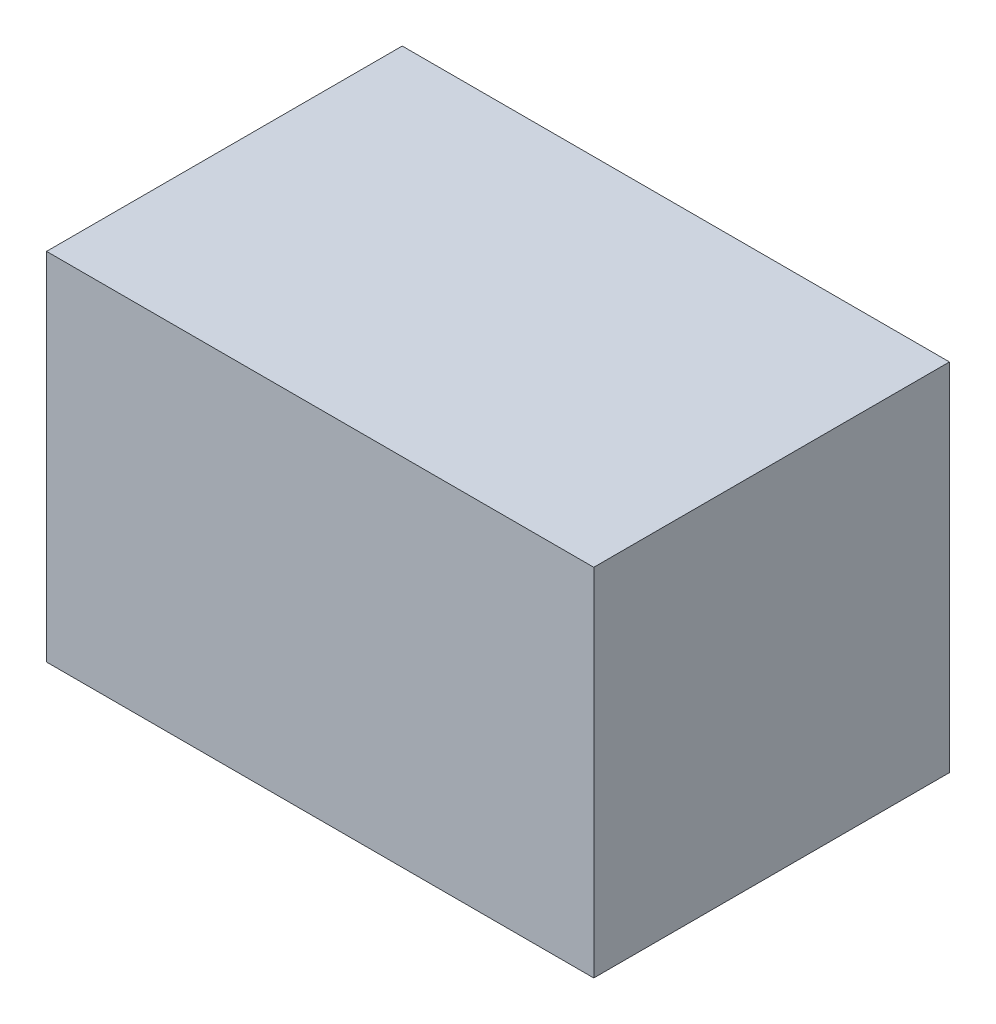
ISO-10303-21;
HEADER;
FILE_DESCRIPTION(('STEP AP214'),'2;1');
FILE_NAME('part.step','',(''),(''),'','','');
FILE_SCHEMA(('AUTOMOTIVE_DESIGN { 1 0 10303 214 1 1 1 1 }'));
ENDSEC;
DATA;
#1=APPLICATION_CONTEXT('core data for automotive mechanical design processes');
#2=APPLICATION_PROTOCOL_DEFINITION('international standard','automotive_design',2000,#1);
#3=PRODUCT_CONTEXT('',#1,'mechanical');
#4=PRODUCT('Part','Part','',(#3));
#5=PRODUCT_RELATED_PRODUCT_CATEGORY('part','',(#4));
#6=PRODUCT_DEFINITION_FORMATION('','',#4);
#7=PRODUCT_DEFINITION_CONTEXT('part definition',#1,'design');
#8=PRODUCT_DEFINITION('design','',#6,#7);
#9=PRODUCT_DEFINITION_SHAPE('','',#8);
#10=(LENGTH_UNIT() NAMED_UNIT(*) SI_UNIT(.MILLI.,.METRE.));
#11=(NAMED_UNIT(*) PLANE_ANGLE_UNIT() SI_UNIT($,.RADIAN.));
#12=(NAMED_UNIT(*) SI_UNIT($,.STERADIAN.) SOLID_ANGLE_UNIT());
#13=UNCERTAINTY_MEASURE_WITH_UNIT(LENGTH_MEASURE(1.E-05),#10,'distance_accuracy_value','');
#14=(GEOMETRIC_REPRESENTATION_CONTEXT(3) GLOBAL_UNCERTAINTY_ASSIGNED_CONTEXT((#13)) GLOBAL_UNIT_ASSIGNED_CONTEXT((#10,
#11,#12)) REPRESENTATION_CONTEXT('',''));
#15=CARTESIAN_POINT('',(0.,0.,0.));
#16=DIRECTION('',(0.,0.,1.));
#17=DIRECTION('',(1.,0.,0.));
#18=AXIS2_PLACEMENT_3D('',#15,#16,#17);
#19=CARTESIAN_POINT('',(-100.,130.,65.));
#20=DIRECTION('',(1.,0.,0.));
#21=DIRECTION('',(0.,0.,-1.));
#22=AXIS2_PLACEMENT_3D('',#19,#20,#21);
#23=PLANE('',#22);
#24=DIRECTION('',(0.,0.,1.));
#25=VECTOR('',#24,1.);
#26=CARTESIAN_POINT('',(-100.,0.,65.));
#27=LINE('',#26,#25);
#28=CARTESIAN_POINT('',(-100.,0.,-65.));
#29=VERTEX_POINT('',#28);
#30=CARTESIAN_POINT('',(-100.,0.,65.));
#31=VERTEX_POINT('',#30);
#32=EDGE_CURVE('E98',#29,#31,#27,.T.);
#33=ORIENTED_EDGE('',*,*,#32,.T.);
#34=DIRECTION('',(0.,-1.,0.));
#35=VECTOR('',#34,1.);
#36=CARTESIAN_POINT('',(-100.,130.,65.));
#37=LINE('',#36,#35);
#38=CARTESIAN_POINT('',(-100.,130.,65.));
#39=VERTEX_POINT('',#38);
#40=EDGE_CURVE('E11',#39,#31,#37,.T.);
#41=ORIENTED_EDGE('',*,*,#40,.F.);
#42=DIRECTION('',(0.,0.,1.));
#43=VECTOR('',#42,1.);
#44=CARTESIAN_POINT('',(-100.,130.,65.));
#45=LINE('',#44,#43);
#46=CARTESIAN_POINT('',(-100.,130.,-65.));
#47=VERTEX_POINT('',#46);
#48=EDGE_CURVE('E86',#47,#39,#45,.T.);
#49=ORIENTED_EDGE('',*,*,#48,.F.);
#50=DIRECTION('',(0.,-1.,0.));
#51=VECTOR('',#50,1.);
#52=CARTESIAN_POINT('',(-100.,130.,-65.));
#53=LINE('',#52,#51);
#54=EDGE_CURVE('E94',#47,#29,#53,.T.);
#55=ORIENTED_EDGE('',*,*,#54,.T.);
#56=EDGE_LOOP('',(#33,#41,#49,#55));
#57=FACE_BOUND('',#56,.T.);
#58=ADVANCED_FACE('F35',(#57),#23,.F.);
#59=CARTESIAN_POINT('',(100.,130.,65.));
#60=DIRECTION('',(0.,0.,-1.));
#61=DIRECTION('',(-1.,0.,0.));
#62=AXIS2_PLACEMENT_3D('',#59,#60,#61);
#63=PLANE('',#62);
#64=DIRECTION('',(1.,0.,0.));
#65=VECTOR('',#64,1.);
#66=CARTESIAN_POINT('',(100.,0.,65.));
#67=LINE('',#66,#65);
#68=CARTESIAN_POINT('',(100.,0.,65.));
#69=VERTEX_POINT('',#68);
#70=EDGE_CURVE('E90',#31,#69,#67,.T.);
#71=ORIENTED_EDGE('',*,*,#70,.T.);
#72=DIRECTION('',(0.,-1.,0.));
#73=VECTOR('',#72,1.);
#74=CARTESIAN_POINT('',(100.,130.,65.));
#75=LINE('',#74,#73);
#76=CARTESIAN_POINT('',(100.,130.,65.));
#77=VERTEX_POINT('',#76);
#78=EDGE_CURVE('E43',#77,#69,#75,.T.);
#79=ORIENTED_EDGE('',*,*,#78,.F.);
#80=DIRECTION('',(1.,0.,0.));
#81=VECTOR('',#80,1.);
#82=CARTESIAN_POINT('',(100.,130.,65.));
#83=LINE('',#82,#81);
#84=EDGE_CURVE('E81',#39,#77,#83,.T.);
#85=ORIENTED_EDGE('',*,*,#84,.F.);
#86=ORIENTED_EDGE('',*,*,#40,.T.);
#87=EDGE_LOOP('',(#71,#79,#85,#86));
#88=FACE_BOUND('',#87,.T.);
#89=ADVANCED_FACE('F89',(#88),#63,.F.);
#90=CARTESIAN_POINT('',(100.,130.,65.));
#91=DIRECTION('',(-1.,0.,0.));
#92=DIRECTION('',(0.,0.,1.));
#93=AXIS2_PLACEMENT_3D('',#90,#91,#92);
#94=PLANE('',#93);
#95=DIRECTION('',(0.,0.,-1.));
#96=VECTOR('',#95,1.);
#97=CARTESIAN_POINT('',(100.,0.,65.));
#98=LINE('',#97,#96);
#99=CARTESIAN_POINT('',(100.,0.,-65.));
#100=VERTEX_POINT('',#99);
#101=EDGE_CURVE('E68',#69,#100,#98,.T.);
#102=ORIENTED_EDGE('',*,*,#101,.T.);
#103=DIRECTION('',(0.,-1.,0.));
#104=VECTOR('',#103,1.);
#105=CARTESIAN_POINT('',(100.,130.,-65.));
#106=LINE('',#105,#104);
#107=CARTESIAN_POINT('',(100.,130.,-65.));
#108=VERTEX_POINT('',#107);
#109=EDGE_CURVE('E91',#108,#100,#106,.T.);
#110=ORIENTED_EDGE('',*,*,#109,.F.);
#111=DIRECTION('',(0.,0.,-1.));
#112=VECTOR('',#111,1.);
#113=CARTESIAN_POINT('',(100.,130.,65.));
#114=LINE('',#113,#112);
#115=EDGE_CURVE('E84',#77,#108,#114,.T.);
#116=ORIENTED_EDGE('',*,*,#115,.F.);
#117=ORIENTED_EDGE('',*,*,#78,.T.);
#118=EDGE_LOOP('',(#102,#110,#116,#117));
#119=FACE_BOUND('',#118,.T.);
#120=ADVANCED_FACE('F92',(#119),#94,.F.);
#121=CARTESIAN_POINT('',(100.,130.,-65.));
#122=DIRECTION('',(0.,0.,1.));
#123=DIRECTION('',(1.,0.,0.));
#124=AXIS2_PLACEMENT_3D('',#121,#122,#123);
#125=PLANE('',#124);
#126=DIRECTION('',(-1.,0.,0.));
#127=VECTOR('',#126,1.);
#128=CARTESIAN_POINT('',(100.,0.,-65.));
#129=LINE('',#128,#127);
#130=EDGE_CURVE('E74',#100,#29,#129,.T.);
#131=ORIENTED_EDGE('',*,*,#130,.T.);
#132=ORIENTED_EDGE('',*,*,#54,.F.);
#133=DIRECTION('',(-1.,0.,0.));
#134=VECTOR('',#133,1.);
#135=CARTESIAN_POINT('',(100.,130.,-65.));
#136=LINE('',#135,#134);
#137=EDGE_CURVE('E51',#108,#47,#136,.T.);
#138=ORIENTED_EDGE('',*,*,#137,.F.);
#139=ORIENTED_EDGE('',*,*,#109,.T.);
#140=EDGE_LOOP('',(#131,#132,#138,#139));
#141=FACE_BOUND('',#140,.T.);
#142=ADVANCED_FACE('F105',(#141),#125,.F.);
#143=CARTESIAN_POINT('',(0.,130.,0.));
#144=DIRECTION('',(0.,1.,0.));
#145=DIRECTION('',(0.,0.,1.));
#146=AXIS2_PLACEMENT_3D('',#143,#144,#145);
#147=PLANE('',#146);
#148=ORIENTED_EDGE('',*,*,#48,.T.);
#149=ORIENTED_EDGE('',*,*,#84,.T.);
#150=ORIENTED_EDGE('',*,*,#115,.T.);
#151=ORIENTED_EDGE('',*,*,#137,.T.);
#152=EDGE_LOOP('',(#148,#149,#150,#151));
#153=FACE_BOUND('',#152,.T.);
#154=ADVANCED_FACE('F82',(#153),#147,.T.);
#155=CARTESIAN_POINT('',(0.,0.,0.));
#156=DIRECTION('',(0.,1.,0.));
#157=DIRECTION('',(0.,0.,1.));
#158=AXIS2_PLACEMENT_3D('',#155,#156,#157);
#159=PLANE('',#158);
#160=ORIENTED_EDGE('',*,*,#32,.F.);
#161=ORIENTED_EDGE('',*,*,#130,.F.);
#162=ORIENTED_EDGE('',*,*,#101,.F.);
#163=ORIENTED_EDGE('',*,*,#70,.F.);
#164=EDGE_LOOP('',(#160,#161,#162,#163));
#165=FACE_BOUND('',#164,.T.);
#166=ADVANCED_FACE('F108',(#165),#159,.F.);
#167=CLOSED_SHELL('',(#58,#89,#120,#142,#154,#166));
#168=MANIFOLD_SOLID_BREP('B2',#167);
#169=ADVANCED_BREP_SHAPE_REPRESENTATION('',(#18,#168),#14);
#170=SHAPE_DEFINITION_REPRESENTATION(#9,#169);
ENDSEC;
END-ISO-10303-21;
